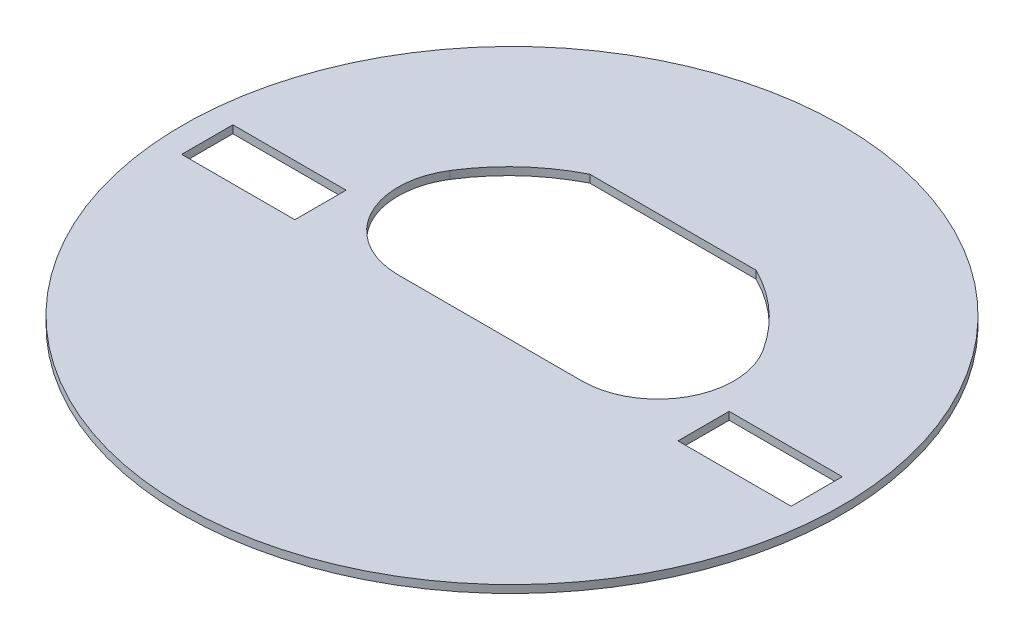
ISO-10303-21;
HEADER;
FILE_DESCRIPTION(('STEP AP214'),'2;1');
FILE_NAME('part.step','',(''),(''),'','','');
FILE_SCHEMA(('AUTOMOTIVE_DESIGN { 1 0 10303 214 1 1 1 1 }'));
ENDSEC;
DATA;
#1=APPLICATION_CONTEXT('core data for automotive mechanical design processes');
#2=APPLICATION_PROTOCOL_DEFINITION('international standard','automotive_design',2000,#1);
#3=PRODUCT_CONTEXT('',#1,'mechanical');
#4=PRODUCT('Part','Part','',(#3));
#5=PRODUCT_RELATED_PRODUCT_CATEGORY('part','',(#4));
#6=PRODUCT_DEFINITION_FORMATION('','',#4);
#7=PRODUCT_DEFINITION_CONTEXT('part definition',#1,'design');
#8=PRODUCT_DEFINITION('design','',#6,#7);
#9=PRODUCT_DEFINITION_SHAPE('','',#8);
#10=(LENGTH_UNIT() NAMED_UNIT(*) SI_UNIT(.MILLI.,.METRE.));
#11=(NAMED_UNIT(*) PLANE_ANGLE_UNIT() SI_UNIT($,.RADIAN.));
#12=(NAMED_UNIT(*) SI_UNIT($,.STERADIAN.) SOLID_ANGLE_UNIT());
#13=UNCERTAINTY_MEASURE_WITH_UNIT(LENGTH_MEASURE(1.E-05),#10,'distance_accuracy_value','');
#14=(GEOMETRIC_REPRESENTATION_CONTEXT(3) GLOBAL_UNCERTAINTY_ASSIGNED_CONTEXT((#13)) GLOBAL_UNIT_ASSIGNED_CONTEXT((#10,
#11,#12)) REPRESENTATION_CONTEXT('',''));
#15=CARTESIAN_POINT('',(0.,0.,0.));
#16=DIRECTION('',(0.,0.,1.));
#17=DIRECTION('',(1.,0.,0.));
#18=AXIS2_PLACEMENT_3D('',#15,#16,#17);
#19=CARTESIAN_POINT('',(0.,16.,0.));
#20=DIRECTION('',(0.,1.,0.));
#21=DIRECTION('',(0.,0.,1.));
#22=AXIS2_PLACEMENT_3D('',#19,#20,#21);
#23=PLANE('',#22);
#24=CARTESIAN_POINT('',(0.,16.,0.));
#25=DIRECTION('',(0.,1.,0.));
#26=DIRECTION('',(0.,0.,1.));
#27=AXIS2_PLACEMENT_3D('',#24,#25,#26);
#28=CIRCLE('',#27,42.5);
#29=CARTESIAN_POINT('',(0.,16.,42.5));
#30=VERTEX_POINT('',#29);
#31=EDGE_CURVE('E12',#30,#30,#28,.T.);
#32=ORIENTED_EDGE('',*,*,#31,.F.);
#33=EDGE_LOOP('',(#32));
#34=FACE_BOUND('',#33,.T.);
#35=CARTESIAN_POINT('',(-11.8918891996092,16.,-6.99999999999999));
#36=DIRECTION('',(0.,1.,0.));
#37=DIRECTION('',(0.,0.,1.));
#38=AXIS2_PLACEMENT_3D('',#35,#36,#37);
#39=CIRCLE('',#38,9.8);
#40=CARTESIAN_POINT('',(-20.1921569930206,16.,-12.2101395909952));
#41=VERTEX_POINT('',#40);
#42=CARTESIAN_POINT('',(-11.8918891996092,16.,2.80000000000001));
#43=VERTEX_POINT('',#42);
#44=EDGE_CURVE('E214',#41,#43,#39,.T.);
#45=ORIENTED_EDGE('',*,*,#44,.T.);
#46=DIRECTION('',(1.,0.,0.));
#47=VECTOR('',#46,1.);
#48=CARTESIAN_POINT('',(0.,16.,2.8));
#49=LINE('',#48,#47);
#50=CARTESIAN_POINT('',(11.8231616387094,16.,2.8));
#51=VERTEX_POINT('',#50);
#52=EDGE_CURVE('E187',#43,#51,#49,.T.);
#53=ORIENTED_EDGE('',*,*,#52,.T.);
#54=CARTESIAN_POINT('',(11.8231616387094,16.,-6.99999999999999));
#55=DIRECTION('',(0.,1.,0.));
#56=DIRECTION('',(0.,0.,1.));
#57=AXIS2_PLACEMENT_3D('',#54,#55,#56);
#58=CIRCLE('',#57,9.8);
#59=CARTESIAN_POINT('',(20.1234294321209,16.,-12.2101395909952));
#60=VERTEX_POINT('',#59);
#61=EDGE_CURVE('E203',#51,#60,#58,.T.);
#62=ORIENTED_EDGE('',*,*,#61,.T.);
#63=CARTESIAN_POINT('',(-0.0343637804498904,16.,0.443056558564638));
#64=DIRECTION('',(0.,1.,0.));
#65=DIRECTION('',(0.,0.,1.));
#66=AXIS2_PLACEMENT_3D('',#63,#64,#65);
#67=CIRCLE('',#66,23.8);
#68=CARTESIAN_POINT('',(10.6974835931212,16.,-20.8));
#69=VERTEX_POINT('',#68);
#70=EDGE_CURVE('E206',#60,#69,#67,.T.);
#71=ORIENTED_EDGE('',*,*,#70,.T.);
#72=DIRECTION('',(-1.,0.,0.));
#73=VECTOR('',#72,1.);
#74=CARTESIAN_POINT('',(0.,16.,-20.8));
#75=LINE('',#74,#73);
#76=CARTESIAN_POINT('',(-10.766211154021,16.,-20.8));
#77=VERTEX_POINT('',#76);
#78=EDGE_CURVE('E209',#69,#77,#75,.T.);
#79=ORIENTED_EDGE('',*,*,#78,.T.);
#80=CARTESIAN_POINT('',(-0.0343637804498904,16.,0.443056558564638));
#81=DIRECTION('',(0.,1.,0.));
#82=DIRECTION('',(0.,0.,1.));
#83=AXIS2_PLACEMENT_3D('',#80,#81,#82);
#84=CIRCLE('',#83,23.8);
#85=EDGE_CURVE('E212',#77,#41,#84,.T.);
#86=ORIENTED_EDGE('',*,*,#85,.T.);
#87=EDGE_LOOP('',(#45,#53,#62,#71,#79,#86));
#88=FACE_BOUND('',#87,.T.);
#89=DIRECTION('',(-1.,0.,0.));
#90=VECTOR('',#89,1.);
#91=CARTESIAN_POINT('',(0.,16.,-3.30000000000001));
#92=LINE('',#91,#90);
#93=CARTESIAN_POINT('',(39.3,16.,-3.30000000000001));
#94=VERTEX_POINT('',#93);
#95=CARTESIAN_POINT('',(24.7,16.,-3.30000000000001));
#96=VERTEX_POINT('',#95);
#97=EDGE_CURVE('E155',#94,#96,#92,.T.);
#98=ORIENTED_EDGE('',*,*,#97,.T.);
#99=DIRECTION('',(0.,0.,1.));
#100=VECTOR('',#99,1.);
#101=CARTESIAN_POINT('',(24.7,16.,0.));
#102=LINE('',#101,#100);
#103=CARTESIAN_POINT('',(24.7,16.,3.3));
#104=VERTEX_POINT('',#103);
#105=EDGE_CURVE('E143',#96,#104,#102,.T.);
#106=ORIENTED_EDGE('',*,*,#105,.T.);
#107=DIRECTION('',(1.,0.,0.));
#108=VECTOR('',#107,1.);
#109=CARTESIAN_POINT('',(0.,16.,3.3));
#110=LINE('',#109,#108);
#111=CARTESIAN_POINT('',(39.3,16.,3.3));
#112=VERTEX_POINT('',#111);
#113=EDGE_CURVE('E153',#104,#112,#110,.T.);
#114=ORIENTED_EDGE('',*,*,#113,.T.);
#115=DIRECTION('',(0.,0.,-1.));
#116=VECTOR('',#115,1.);
#117=CARTESIAN_POINT('',(39.3,16.,0.));
#118=LINE('',#117,#116);
#119=EDGE_CURVE('E157',#112,#94,#118,.T.);
#120=ORIENTED_EDGE('',*,*,#119,.T.);
#121=EDGE_LOOP('',(#98,#106,#114,#120));
#122=FACE_BOUND('',#121,.T.);
#123=DIRECTION('',(0.,0.,-1.));
#124=VECTOR('',#123,1.);
#125=CARTESIAN_POINT('',(-24.7,16.,0.));
#126=LINE('',#125,#124);
#127=CARTESIAN_POINT('',(-24.7,16.,3.3));
#128=VERTEX_POINT('',#127);
#129=CARTESIAN_POINT('',(-24.7,16.,-3.3));
#130=VERTEX_POINT('',#129);
#131=EDGE_CURVE('E152',#128,#130,#126,.T.);
#132=ORIENTED_EDGE('',*,*,#131,.T.);
#133=DIRECTION('',(-1.,0.,0.));
#134=VECTOR('',#133,1.);
#135=CARTESIAN_POINT('',(0.,16.,-3.30000000000001));
#136=LINE('',#135,#134);
#137=CARTESIAN_POINT('',(-39.3,16.,-3.3));
#138=VERTEX_POINT('',#137);
#139=EDGE_CURVE('E217',#130,#138,#136,.T.);
#140=ORIENTED_EDGE('',*,*,#139,.T.);
#141=DIRECTION('',(0.,0.,1.));
#142=VECTOR('',#141,1.);
#143=CARTESIAN_POINT('',(-39.3,16.,0.));
#144=LINE('',#143,#142);
#145=CARTESIAN_POINT('',(-39.3,16.,3.3));
#146=VERTEX_POINT('',#145);
#147=EDGE_CURVE('E220',#138,#146,#144,.T.);
#148=ORIENTED_EDGE('',*,*,#147,.T.);
#149=DIRECTION('',(1.,0.,0.));
#150=VECTOR('',#149,1.);
#151=CARTESIAN_POINT('',(0.,16.,3.3));
#152=LINE('',#151,#150);
#153=EDGE_CURVE('E223',#146,#128,#152,.T.);
#154=ORIENTED_EDGE('',*,*,#153,.T.);
#155=EDGE_LOOP('',(#132,#140,#148,#154));
#156=FACE_BOUND('',#155,.T.);
#157=ADVANCED_FACE('F39',(#34,#88,#122,#156),#23,.F.);
#158=CARTESIAN_POINT('',(0.,17.,0.));
#159=DIRECTION('',(0.,1.,0.));
#160=DIRECTION('',(0.,0.,1.));
#161=AXIS2_PLACEMENT_3D('',#158,#159,#160);
#162=PLANE('',#161);
#163=CARTESIAN_POINT('',(0.,17.,0.));
#164=DIRECTION('',(0.,1.,0.));
#165=DIRECTION('',(0.,0.,1.));
#166=AXIS2_PLACEMENT_3D('',#163,#164,#165);
#167=CIRCLE('',#166,42.5);
#168=CARTESIAN_POINT('',(0.,17.,42.5));
#169=VERTEX_POINT('',#168);
#170=EDGE_CURVE('E43',#169,#169,#167,.T.);
#171=ORIENTED_EDGE('',*,*,#170,.T.);
#172=EDGE_LOOP('',(#171));
#173=FACE_BOUND('',#172,.T.);
#174=DIRECTION('',(-1.,0.,0.));
#175=VECTOR('',#174,1.);
#176=CARTESIAN_POINT('',(0.,17.,-3.30000000000001));
#177=LINE('',#176,#175);
#178=CARTESIAN_POINT('',(39.3,17.,-3.30000000000001));
#179=VERTEX_POINT('',#178);
#180=CARTESIAN_POINT('',(24.7,17.,-3.30000000000001));
#181=VERTEX_POINT('',#180);
#182=EDGE_CURVE('E160',#179,#181,#177,.T.);
#183=ORIENTED_EDGE('',*,*,#182,.F.);
#184=DIRECTION('',(0.,0.,-1.));
#185=VECTOR('',#184,1.);
#186=CARTESIAN_POINT('',(39.3,17.,0.));
#187=LINE('',#186,#185);
#188=CARTESIAN_POINT('',(39.3,17.,3.3));
#189=VERTEX_POINT('',#188);
#190=EDGE_CURVE('E260',#189,#179,#187,.T.);
#191=ORIENTED_EDGE('',*,*,#190,.F.);
#192=DIRECTION('',(1.,0.,0.));
#193=VECTOR('',#192,1.);
#194=CARTESIAN_POINT('',(0.,17.,3.3));
#195=LINE('',#194,#193);
#196=CARTESIAN_POINT('',(24.7,17.,3.3));
#197=VERTEX_POINT('',#196);
#198=EDGE_CURVE('E257',#197,#189,#195,.T.);
#199=ORIENTED_EDGE('',*,*,#198,.F.);
#200=DIRECTION('',(0.,0.,1.));
#201=VECTOR('',#200,1.);
#202=CARTESIAN_POINT('',(24.7,17.,0.));
#203=LINE('',#202,#201);
#204=EDGE_CURVE('E255',#181,#197,#203,.T.);
#205=ORIENTED_EDGE('',*,*,#204,.F.);
#206=EDGE_LOOP('',(#183,#191,#199,#205));
#207=FACE_BOUND('',#206,.T.);
#208=DIRECTION('',(0.,0.,-1.));
#209=VECTOR('',#208,1.);
#210=CARTESIAN_POINT('',(-24.7,17.,0.));
#211=LINE('',#210,#209);
#212=CARTESIAN_POINT('',(-24.7,17.,3.3));
#213=VERTEX_POINT('',#212);
#214=CARTESIAN_POINT('',(-24.7,17.,-3.3));
#215=VERTEX_POINT('',#214);
#216=EDGE_CURVE('E252',#213,#215,#211,.T.);
#217=ORIENTED_EDGE('',*,*,#216,.F.);
#218=DIRECTION('',(1.,0.,0.));
#219=VECTOR('',#218,1.);
#220=CARTESIAN_POINT('',(0.,17.,3.3));
#221=LINE('',#220,#219);
#222=CARTESIAN_POINT('',(-39.3,17.,3.3));
#223=VERTEX_POINT('',#222);
#224=EDGE_CURVE('E249',#223,#213,#221,.T.);
#225=ORIENTED_EDGE('',*,*,#224,.F.);
#226=DIRECTION('',(0.,0.,1.));
#227=VECTOR('',#226,1.);
#228=CARTESIAN_POINT('',(-39.3,17.,0.));
#229=LINE('',#228,#227);
#230=CARTESIAN_POINT('',(-39.3,17.,-3.3));
#231=VERTEX_POINT('',#230);
#232=EDGE_CURVE('E246',#231,#223,#229,.T.);
#233=ORIENTED_EDGE('',*,*,#232,.F.);
#234=DIRECTION('',(-1.,0.,0.));
#235=VECTOR('',#234,1.);
#236=CARTESIAN_POINT('',(0.,17.,-3.30000000000001));
#237=LINE('',#236,#235);
#238=EDGE_CURVE('E243',#215,#231,#237,.T.);
#239=ORIENTED_EDGE('',*,*,#238,.F.);
#240=EDGE_LOOP('',(#217,#225,#233,#239));
#241=FACE_BOUND('',#240,.T.);
#242=CARTESIAN_POINT('',(-11.8918891996092,17.,-6.99999999999999));
#243=DIRECTION('',(0.,1.,0.));
#244=DIRECTION('',(0.,0.,1.));
#245=AXIS2_PLACEMENT_3D('',#242,#243,#244);
#246=CIRCLE('',#245,9.8);
#247=CARTESIAN_POINT('',(-20.1921569930206,17.,-12.2101395909952));
#248=VERTEX_POINT('',#247);
#249=CARTESIAN_POINT('',(-11.8918891996092,17.,2.80000000000001));
#250=VERTEX_POINT('',#249);
#251=EDGE_CURVE('E240',#248,#250,#246,.T.);
#252=ORIENTED_EDGE('',*,*,#251,.F.);
#253=CARTESIAN_POINT('',(-0.0343637804498904,17.,0.443056558564638));
#254=DIRECTION('',(0.,1.,0.));
#255=DIRECTION('',(0.,0.,1.));
#256=AXIS2_PLACEMENT_3D('',#253,#254,#255);
#257=CIRCLE('',#256,23.8);
#258=CARTESIAN_POINT('',(-10.766211154021,17.,-20.8));
#259=VERTEX_POINT('',#258);
#260=EDGE_CURVE('E237',#259,#248,#257,.T.);
#261=ORIENTED_EDGE('',*,*,#260,.F.);
#262=DIRECTION('',(-1.,0.,0.));
#263=VECTOR('',#262,1.);
#264=CARTESIAN_POINT('',(0.,17.,-20.8));
#265=LINE('',#264,#263);
#266=CARTESIAN_POINT('',(10.6974835931212,17.,-20.8));
#267=VERTEX_POINT('',#266);
#268=EDGE_CURVE('E234',#267,#259,#265,.T.);
#269=ORIENTED_EDGE('',*,*,#268,.F.);
#270=CARTESIAN_POINT('',(-0.0343637804498904,17.,0.443056558564638));
#271=DIRECTION('',(0.,1.,0.));
#272=DIRECTION('',(0.,0.,1.));
#273=AXIS2_PLACEMENT_3D('',#270,#271,#272);
#274=CIRCLE('',#273,23.8);
#275=CARTESIAN_POINT('',(20.1234294321209,17.,-12.2101395909952));
#276=VERTEX_POINT('',#275);
#277=EDGE_CURVE('E231',#276,#267,#274,.T.);
#278=ORIENTED_EDGE('',*,*,#277,.F.);
#279=CARTESIAN_POINT('',(11.8231616387094,17.,-6.99999999999999));
#280=DIRECTION('',(0.,1.,0.));
#281=DIRECTION('',(0.,0.,1.));
#282=AXIS2_PLACEMENT_3D('',#279,#280,#281);
#283=CIRCLE('',#282,9.8);
#284=CARTESIAN_POINT('',(11.8231616387094,17.,2.8));
#285=VERTEX_POINT('',#284);
#286=EDGE_CURVE('E165',#285,#276,#283,.T.);
#287=ORIENTED_EDGE('',*,*,#286,.F.);
#288=DIRECTION('',(1.,0.,0.));
#289=VECTOR('',#288,1.);
#290=CARTESIAN_POINT('',(0.,17.,2.8));
#291=LINE('',#290,#289);
#292=EDGE_CURVE('E162',#250,#285,#291,.T.);
#293=ORIENTED_EDGE('',*,*,#292,.F.);
#294=EDGE_LOOP('',(#252,#261,#269,#278,#287,#293));
#295=FACE_BOUND('',#294,.T.);
#296=ADVANCED_FACE('F41',(#173,#207,#241,#295),#162,.T.);
#297=CARTESIAN_POINT('',(0.,17.,0.));
#298=DIRECTION('',(0.,-1.,0.));
#299=DIRECTION('',(0.,0.,-1.));
#300=AXIS2_PLACEMENT_3D('',#297,#298,#299);
#301=CYLINDRICAL_SURFACE('',#300,42.5);
#302=ORIENTED_EDGE('',*,*,#31,.T.);
#303=EDGE_LOOP('',(#302));
#304=FACE_BOUND('',#303,.T.);
#305=ORIENTED_EDGE('',*,*,#170,.F.);
#306=EDGE_LOOP('',(#305));
#307=FACE_BOUND('',#306,.T.);
#308=ADVANCED_FACE('F267',(#304,#307),#301,.T.);
#309=CARTESIAN_POINT('',(0.,17.,2.8));
#310=DIRECTION('',(0.,0.,-1.));
#311=DIRECTION('',(-1.,0.,0.));
#312=AXIS2_PLACEMENT_3D('',#309,#310,#311);
#313=PLANE('',#312);
#314=ORIENTED_EDGE('',*,*,#52,.F.);
#315=DIRECTION('',(0.,-1.,0.));
#316=VECTOR('',#315,1.);
#317=CARTESIAN_POINT('',(-11.8918891996092,17.,2.80000000000001));
#318=LINE('',#317,#316);
#319=EDGE_CURVE('E174',#250,#43,#318,.T.);
#320=ORIENTED_EDGE('',*,*,#319,.F.);
#321=ORIENTED_EDGE('',*,*,#292,.T.);
#322=DIRECTION('',(0.,-1.,0.));
#323=VECTOR('',#322,1.);
#324=CARTESIAN_POINT('',(11.8231616387094,17.,2.8));
#325=LINE('',#324,#323);
#326=EDGE_CURVE('E196',#285,#51,#325,.T.);
#327=ORIENTED_EDGE('',*,*,#326,.T.);
#328=EDGE_LOOP('',(#314,#320,#321,#327));
#329=FACE_BOUND('',#328,.T.);
#330=ADVANCED_FACE('F269',(#329),#313,.T.);
#331=CARTESIAN_POINT('',(11.8231616387094,17.,-6.99999999999999));
#332=DIRECTION('',(0.,-1.,0.));
#333=DIRECTION('',(0.,0.,-1.));
#334=AXIS2_PLACEMENT_3D('',#331,#332,#333);
#335=CYLINDRICAL_SURFACE('',#334,9.8);
#336=ORIENTED_EDGE('',*,*,#61,.F.);
#337=ORIENTED_EDGE('',*,*,#326,.F.);
#338=ORIENTED_EDGE('',*,*,#286,.T.);
#339=DIRECTION('',(0.,-1.,0.));
#340=VECTOR('',#339,1.);
#341=CARTESIAN_POINT('',(20.1234294321209,17.,-12.2101395909952));
#342=LINE('',#341,#340);
#343=EDGE_CURVE('E193',#276,#60,#342,.T.);
#344=ORIENTED_EDGE('',*,*,#343,.T.);
#345=EDGE_LOOP('',(#336,#337,#338,#344));
#346=FACE_BOUND('',#345,.T.);
#347=ADVANCED_FACE('F275',(#346),#335,.F.);
#348=CARTESIAN_POINT('',(-0.0343637804498904,17.,0.443056558564638));
#349=DIRECTION('',(0.,-1.,0.));
#350=DIRECTION('',(0.,0.,-1.));
#351=AXIS2_PLACEMENT_3D('',#348,#349,#350);
#352=CYLINDRICAL_SURFACE('',#351,23.8);
#353=ORIENTED_EDGE('',*,*,#70,.F.);
#354=ORIENTED_EDGE('',*,*,#343,.F.);
#355=ORIENTED_EDGE('',*,*,#277,.T.);
#356=DIRECTION('',(0.,-1.,0.));
#357=VECTOR('',#356,1.);
#358=CARTESIAN_POINT('',(10.6974835931212,17.,-20.8));
#359=LINE('',#358,#357);
#360=EDGE_CURVE('E190',#267,#69,#359,.T.);
#361=ORIENTED_EDGE('',*,*,#360,.T.);
#362=EDGE_LOOP('',(#353,#354,#355,#361));
#363=FACE_BOUND('',#362,.T.);
#364=ADVANCED_FACE('F284',(#363),#352,.F.);
#365=CARTESIAN_POINT('',(-11.8918891996092,17.,-6.99999999999999));
#366=DIRECTION('',(0.,-1.,0.));
#367=DIRECTION('',(0.,0.,-1.));
#368=AXIS2_PLACEMENT_3D('',#365,#366,#367);
#369=CYLINDRICAL_SURFACE('',#368,9.8);
#370=ORIENTED_EDGE('',*,*,#44,.F.);
#371=DIRECTION('',(0.,-1.,0.));
#372=VECTOR('',#371,1.);
#373=CARTESIAN_POINT('',(-20.1921569930206,17.,-12.2101395909952));
#374=LINE('',#373,#372);
#375=EDGE_CURVE('E183',#248,#41,#374,.T.);
#376=ORIENTED_EDGE('',*,*,#375,.F.);
#377=ORIENTED_EDGE('',*,*,#251,.T.);
#378=ORIENTED_EDGE('',*,*,#319,.T.);
#379=EDGE_LOOP('',(#370,#376,#377,#378));
#380=FACE_BOUND('',#379,.T.);
#381=ADVANCED_FACE('F288',(#380),#369,.F.);
#382=CARTESIAN_POINT('',(0.,17.,-3.30000000000001));
#383=DIRECTION('',(0.,0.,1.));
#384=DIRECTION('',(1.,0.,0.));
#385=AXIS2_PLACEMENT_3D('',#382,#383,#384);
#386=PLANE('',#385);
#387=ORIENTED_EDGE('',*,*,#139,.F.);
#388=DIRECTION('',(0.,-1.,0.));
#389=VECTOR('',#388,1.);
#390=CARTESIAN_POINT('',(-24.7,17.,-3.3));
#391=LINE('',#390,#389);
#392=EDGE_CURVE('E180',#215,#130,#391,.T.);
#393=ORIENTED_EDGE('',*,*,#392,.F.);
#394=ORIENTED_EDGE('',*,*,#238,.T.);
#395=DIRECTION('',(0.,-1.,0.));
#396=VECTOR('',#395,1.);
#397=CARTESIAN_POINT('',(-39.3,17.,-3.3));
#398=LINE('',#397,#396);
#399=EDGE_CURVE('E177',#231,#138,#398,.T.);
#400=ORIENTED_EDGE('',*,*,#399,.T.);
#401=EDGE_LOOP('',(#387,#393,#394,#400));
#402=FACE_BOUND('',#401,.T.);
#403=ADVANCED_FACE('F301',(#402),#386,.T.);
#404=CARTESIAN_POINT('',(-24.7,17.,0.));
#405=DIRECTION('',(-1.,0.,0.));
#406=DIRECTION('',(0.,0.,1.));
#407=AXIS2_PLACEMENT_3D('',#404,#405,#406);
#408=PLANE('',#407);
#409=ORIENTED_EDGE('',*,*,#131,.F.);
#410=DIRECTION('',(0.,-1.,0.));
#411=VECTOR('',#410,1.);
#412=CARTESIAN_POINT('',(-24.7,17.,3.3));
#413=LINE('',#412,#411);
#414=EDGE_CURVE('E170',#213,#128,#413,.T.);
#415=ORIENTED_EDGE('',*,*,#414,.F.);
#416=ORIENTED_EDGE('',*,*,#216,.T.);
#417=ORIENTED_EDGE('',*,*,#392,.T.);
#418=EDGE_LOOP('',(#409,#415,#416,#417));
#419=FACE_BOUND('',#418,.T.);
#420=ADVANCED_FACE('F305',(#419),#408,.T.);
#421=CARTESIAN_POINT('',(24.7,17.,0.));
#422=DIRECTION('',(1.,0.,0.));
#423=DIRECTION('',(0.,0.,-1.));
#424=AXIS2_PLACEMENT_3D('',#421,#422,#423);
#425=PLANE('',#424);
#426=ORIENTED_EDGE('',*,*,#105,.F.);
#427=DIRECTION('',(0.,-1.,0.));
#428=VECTOR('',#427,1.);
#429=CARTESIAN_POINT('',(24.7,17.,-3.30000000000001));
#430=LINE('',#429,#428);
#431=EDGE_CURVE('E148',#181,#96,#430,.T.);
#432=ORIENTED_EDGE('',*,*,#431,.F.);
#433=ORIENTED_EDGE('',*,*,#204,.T.);
#434=DIRECTION('',(0.,-1.,0.));
#435=VECTOR('',#434,1.);
#436=CARTESIAN_POINT('',(24.7,17.,3.3));
#437=LINE('',#436,#435);
#438=EDGE_CURVE('E149',#197,#104,#437,.T.);
#439=ORIENTED_EDGE('',*,*,#438,.T.);
#440=EDGE_LOOP('',(#426,#432,#433,#439));
#441=FACE_BOUND('',#440,.T.);
#442=ADVANCED_FACE('F145',(#441),#425,.T.);
#443=CARTESIAN_POINT('',(0.,17.,-3.30000000000001));
#444=DIRECTION('',(0.,0.,1.));
#445=DIRECTION('',(1.,0.,0.));
#446=AXIS2_PLACEMENT_3D('',#443,#444,#445);
#447=PLANE('',#446);
#448=ORIENTED_EDGE('',*,*,#97,.F.);
#449=DIRECTION('',(0.,-1.,0.));
#450=VECTOR('',#449,1.);
#451=CARTESIAN_POINT('',(39.3,17.,-3.30000000000001));
#452=LINE('',#451,#450);
#453=EDGE_CURVE('E54',#179,#94,#452,.T.);
#454=ORIENTED_EDGE('',*,*,#453,.F.);
#455=ORIENTED_EDGE('',*,*,#182,.T.);
#456=ORIENTED_EDGE('',*,*,#431,.T.);
#457=EDGE_LOOP('',(#448,#454,#455,#456));
#458=FACE_BOUND('',#457,.T.);
#459=ADVANCED_FACE('F159',(#458),#447,.T.);
#460=CARTESIAN_POINT('',(0.,17.,3.3));
#461=DIRECTION('',(0.,0.,-1.));
#462=DIRECTION('',(-1.,0.,0.));
#463=AXIS2_PLACEMENT_3D('',#460,#461,#462);
#464=PLANE('',#463);
#465=ORIENTED_EDGE('',*,*,#113,.F.);
#466=ORIENTED_EDGE('',*,*,#438,.F.);
#467=ORIENTED_EDGE('',*,*,#198,.T.);
#468=DIRECTION('',(0.,-1.,0.));
#469=VECTOR('',#468,1.);
#470=CARTESIAN_POINT('',(39.3,17.,3.3));
#471=LINE('',#470,#469);
#472=EDGE_CURVE('E62',#189,#112,#471,.T.);
#473=ORIENTED_EDGE('',*,*,#472,.T.);
#474=EDGE_LOOP('',(#465,#466,#467,#473));
#475=FACE_BOUND('',#474,.T.);
#476=ADVANCED_FACE('F320',(#475),#464,.T.);
#477=CARTESIAN_POINT('',(39.3,17.,0.));
#478=DIRECTION('',(-1.,0.,0.));
#479=DIRECTION('',(0.,0.,1.));
#480=AXIS2_PLACEMENT_3D('',#477,#478,#479);
#481=PLANE('',#480);
#482=ORIENTED_EDGE('',*,*,#119,.F.);
#483=ORIENTED_EDGE('',*,*,#472,.F.);
#484=ORIENTED_EDGE('',*,*,#190,.T.);
#485=ORIENTED_EDGE('',*,*,#453,.T.);
#486=EDGE_LOOP('',(#482,#483,#484,#485));
#487=FACE_BOUND('',#486,.T.);
#488=ADVANCED_FACE('F310',(#487),#481,.T.);
#489=CARTESIAN_POINT('',(-39.3,17.,0.));
#490=DIRECTION('',(1.,0.,0.));
#491=DIRECTION('',(0.,0.,-1.));
#492=AXIS2_PLACEMENT_3D('',#489,#490,#491);
#493=PLANE('',#492);
#494=ORIENTED_EDGE('',*,*,#147,.F.);
#495=ORIENTED_EDGE('',*,*,#399,.F.);
#496=ORIENTED_EDGE('',*,*,#232,.T.);
#497=DIRECTION('',(0.,-1.,0.));
#498=VECTOR('',#497,1.);
#499=CARTESIAN_POINT('',(-39.3,17.,3.3));
#500=LINE('',#499,#498);
#501=EDGE_CURVE('E173',#223,#146,#500,.T.);
#502=ORIENTED_EDGE('',*,*,#501,.T.);
#503=EDGE_LOOP('',(#494,#495,#496,#502));
#504=FACE_BOUND('',#503,.T.);
#505=ADVANCED_FACE('F307',(#504),#493,.T.);
#506=CARTESIAN_POINT('',(0.,17.,3.3));
#507=DIRECTION('',(0.,0.,-1.));
#508=DIRECTION('',(-1.,0.,0.));
#509=AXIS2_PLACEMENT_3D('',#506,#507,#508);
#510=PLANE('',#509);
#511=ORIENTED_EDGE('',*,*,#153,.F.);
#512=ORIENTED_EDGE('',*,*,#501,.F.);
#513=ORIENTED_EDGE('',*,*,#224,.T.);
#514=ORIENTED_EDGE('',*,*,#414,.T.);
#515=EDGE_LOOP('',(#511,#512,#513,#514));
#516=FACE_BOUND('',#515,.T.);
#517=ADVANCED_FACE('F294',(#516),#510,.T.);
#518=CARTESIAN_POINT('',(0.,17.,-20.8));
#519=DIRECTION('',(0.,0.,1.));
#520=DIRECTION('',(1.,0.,0.));
#521=AXIS2_PLACEMENT_3D('',#518,#519,#520);
#522=PLANE('',#521);
#523=ORIENTED_EDGE('',*,*,#78,.F.);
#524=ORIENTED_EDGE('',*,*,#360,.F.);
#525=ORIENTED_EDGE('',*,*,#268,.T.);
#526=DIRECTION('',(0.,-1.,0.));
#527=VECTOR('',#526,1.);
#528=CARTESIAN_POINT('',(-10.766211154021,17.,-20.8));
#529=LINE('',#528,#527);
#530=EDGE_CURVE('E186',#259,#77,#529,.T.);
#531=ORIENTED_EDGE('',*,*,#530,.T.);
#532=EDGE_LOOP('',(#523,#524,#525,#531));
#533=FACE_BOUND('',#532,.T.);
#534=ADVANCED_FACE('F290',(#533),#522,.T.);
#535=CARTESIAN_POINT('',(-0.0343637804498904,17.,0.443056558564638));
#536=DIRECTION('',(0.,-1.,0.));
#537=DIRECTION('',(0.,0.,-1.));
#538=AXIS2_PLACEMENT_3D('',#535,#536,#537);
#539=CYLINDRICAL_SURFACE('',#538,23.8);
#540=ORIENTED_EDGE('',*,*,#85,.F.);
#541=ORIENTED_EDGE('',*,*,#530,.F.);
#542=ORIENTED_EDGE('',*,*,#260,.T.);
#543=ORIENTED_EDGE('',*,*,#375,.T.);
#544=EDGE_LOOP('',(#540,#541,#542,#543));
#545=FACE_BOUND('',#544,.T.);
#546=ADVANCED_FACE('F293',(#545),#539,.F.);
#547=CLOSED_SHELL('',(#157,#296,#308,#330,#347,#364,#381,#403,#420,#442,#459,#476,#488,#505,
#517,#534,#546));
#548=MANIFOLD_SOLID_BREP('B2',#547);
#549=ADVANCED_BREP_SHAPE_REPRESENTATION('',(#18,#548),#14);
#550=SHAPE_DEFINITION_REPRESENTATION(#9,#549);
ENDSEC;
END-ISO-10303-21;
